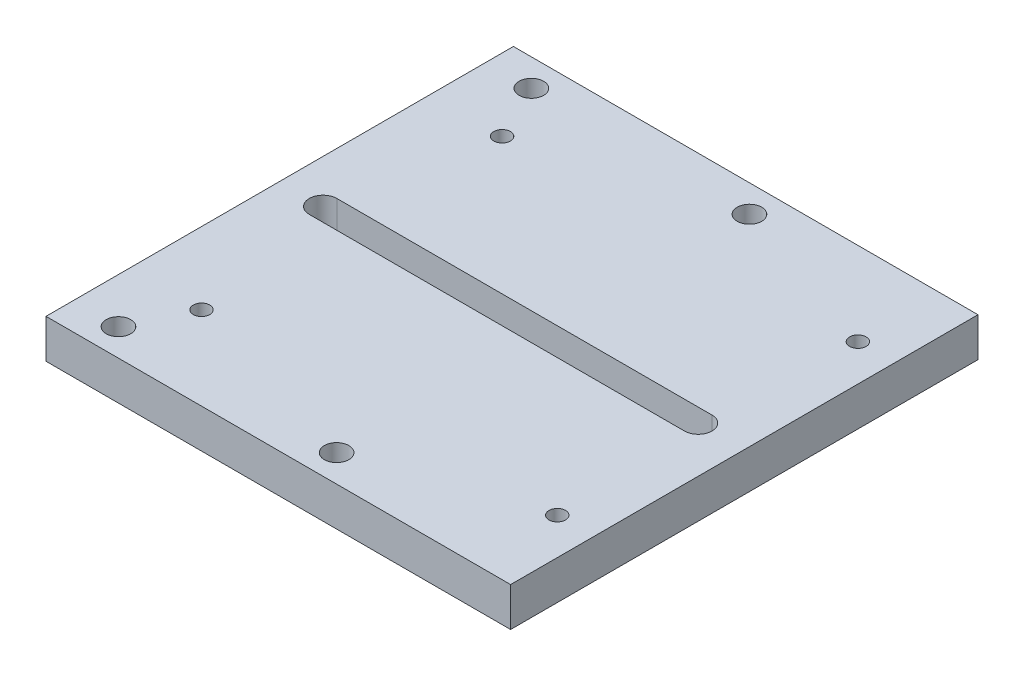
ISO-10303-21;
HEADER;
FILE_DESCRIPTION(('STEP AP214'),'2;1');
FILE_NAME('part.step','',(''),(''),'','','');
FILE_SCHEMA(('AUTOMOTIVE_DESIGN { 1 0 10303 214 1 1 1 1 }'));
ENDSEC;
DATA;
#1=APPLICATION_CONTEXT('core data for automotive mechanical design processes');
#2=APPLICATION_PROTOCOL_DEFINITION('international standard','automotive_design',2000,#1);
#3=PRODUCT_CONTEXT('',#1,'mechanical');
#4=PRODUCT('Part','Part','',(#3));
#5=PRODUCT_RELATED_PRODUCT_CATEGORY('part','',(#4));
#6=PRODUCT_DEFINITION_FORMATION('','',#4);
#7=PRODUCT_DEFINITION_CONTEXT('part definition',#1,'design');
#8=PRODUCT_DEFINITION('design','',#6,#7);
#9=PRODUCT_DEFINITION_SHAPE('','',#8);
#10=(LENGTH_UNIT() NAMED_UNIT(*) SI_UNIT(.MILLI.,.METRE.));
#11=(NAMED_UNIT(*) PLANE_ANGLE_UNIT() SI_UNIT($,.RADIAN.));
#12=(NAMED_UNIT(*) SI_UNIT($,.STERADIAN.) SOLID_ANGLE_UNIT());
#13=UNCERTAINTY_MEASURE_WITH_UNIT(LENGTH_MEASURE(1.E-05),#10,'distance_accuracy_value','');
#14=(GEOMETRIC_REPRESENTATION_CONTEXT(3) GLOBAL_UNCERTAINTY_ASSIGNED_CONTEXT((#13)) GLOBAL_UNIT_ASSIGNED_CONTEXT((#10,
#11,#12)) REPRESENTATION_CONTEXT('',''));
#15=CARTESIAN_POINT('',(0.,0.,0.));
#16=DIRECTION('',(0.,0.,1.));
#17=DIRECTION('',(1.,0.,0.));
#18=AXIS2_PLACEMENT_3D('',#15,#16,#17);
#19=CARTESIAN_POINT('',(0.,6.35,0.));
#20=DIRECTION('',(0.,1.,0.));
#21=DIRECTION('',(0.,0.,1.));
#22=AXIS2_PLACEMENT_3D('',#19,#20,#21);
#23=PLANE('',#22);
#24=CARTESIAN_POINT('',(2.17366498787586,6.35,-33.655));
#25=DIRECTION('',(0.,1.,0.));
#26=DIRECTION('',(0.,0.,1.));
#27=AXIS2_PLACEMENT_3D('',#24,#25,#26);
#28=CIRCLE('',#27,1.999869);
#29=CARTESIAN_POINT('',(2.17366498787586,6.35,-31.655131));
#30=VERTEX_POINT('',#29);
#31=EDGE_CURVE('E146',#30,#30,#28,.T.);
#32=ORIENTED_EDGE('',*,*,#31,.F.);
#33=EDGE_LOOP('',(#32));
#34=FACE_BOUND('',#33,.T.);
#35=CARTESIAN_POINT('',(-33.3863350121241,6.35,-33.655));
#36=DIRECTION('',(0.,1.,0.));
#37=DIRECTION('',(0.,0.,1.));
#38=AXIS2_PLACEMENT_3D('',#35,#36,#37);
#39=CIRCLE('',#38,1.999869);
#40=CARTESIAN_POINT('',(-33.3863350121241,6.35,-31.655131));
#41=VERTEX_POINT('',#40);
#42=EDGE_CURVE('E158',#41,#41,#39,.T.);
#43=ORIENTED_EDGE('',*,*,#42,.F.);
#44=EDGE_LOOP('',(#43));
#45=FACE_BOUND('',#44,.T.);
#46=CARTESIAN_POINT('',(-29.,6.35,-24.5));
#47=DIRECTION('',(0.,1.,0.));
#48=DIRECTION('',(0.,0.,1.));
#49=AXIS2_PLACEMENT_3D('',#46,#47,#48);
#50=CIRCLE('',#49,1.35);
#51=CARTESIAN_POINT('',(-29.,6.35,-23.15));
#52=VERTEX_POINT('',#51);
#53=EDGE_CURVE('E170',#52,#52,#50,.T.);
#54=ORIENTED_EDGE('',*,*,#53,.F.);
#55=EDGE_LOOP('',(#54));
#56=FACE_BOUND('',#55,.T.);
#57=CARTESIAN_POINT('',(-29.,6.35,24.5));
#58=DIRECTION('',(0.,1.,0.));
#59=DIRECTION('',(0.,0.,1.));
#60=AXIS2_PLACEMENT_3D('',#57,#58,#59);
#61=CIRCLE('',#60,1.35000000000001);
#62=CARTESIAN_POINT('',(-29.,6.35,25.85));
#63=VERTEX_POINT('',#62);
#64=EDGE_CURVE('E182',#63,#63,#61,.T.);
#65=ORIENTED_EDGE('',*,*,#64,.F.);
#66=EDGE_LOOP('',(#65));
#67=FACE_BOUND('',#66,.T.);
#68=DIRECTION('',(0.,0.,1.));
#69=VECTOR('',#68,1.);
#70=CARTESIAN_POINT('',(-40.7574186381568,6.35,-38.1));
#71=LINE('',#70,#69);
#72=CARTESIAN_POINT('',(-40.7574186381568,6.35,-38.1));
#73=VERTEX_POINT('',#72);
#74=CARTESIAN_POINT('',(-40.7574186381568,6.35,38.1));
#75=VERTEX_POINT('',#74);
#76=EDGE_CURVE('E188',#73,#75,#71,.T.);
#77=ORIENTED_EDGE('',*,*,#76,.T.);
#78=DIRECTION('',(1.,0.,0.));
#79=VECTOR('',#78,1.);
#80=CARTESIAN_POINT('',(-40.7574186381568,6.35,38.1));
#81=LINE('',#80,#79);
#82=CARTESIAN_POINT('',(34.9873889024097,6.35,38.1));
#83=VERTEX_POINT('',#82);
#84=EDGE_CURVE('E191',#75,#83,#81,.T.);
#85=ORIENTED_EDGE('',*,*,#84,.T.);
#86=DIRECTION('',(0.,0.,-1.));
#87=VECTOR('',#86,1.);
#88=CARTESIAN_POINT('',(34.9873889024097,6.35,-38.1));
#89=LINE('',#88,#87);
#90=CARTESIAN_POINT('',(34.9873889024097,6.35,-38.1));
#91=VERTEX_POINT('',#90);
#92=EDGE_CURVE('E194',#83,#91,#89,.T.);
#93=ORIENTED_EDGE('',*,*,#92,.T.);
#94=DIRECTION('',(-1.,0.,0.));
#95=VECTOR('',#94,1.);
#96=CARTESIAN_POINT('',(-40.7574186381568,6.35,-38.1));
#97=LINE('',#96,#95);
#98=EDGE_CURVE('E196',#91,#73,#97,.T.);
#99=ORIENTED_EDGE('',*,*,#98,.T.);
#100=EDGE_LOOP('',(#77,#85,#93,#99));
#101=FACE_BOUND('',#100,.T.);
#102=CARTESIAN_POINT('',(29.,6.35,24.5));
#103=DIRECTION('',(0.,1.,0.));
#104=DIRECTION('',(0.,0.,1.));
#105=AXIS2_PLACEMENT_3D('',#102,#103,#104);
#106=CIRCLE('',#105,1.35);
#107=CARTESIAN_POINT('',(29.,6.35,25.85));
#108=VERTEX_POINT('',#107);
#109=EDGE_CURVE('E176',#108,#108,#106,.T.);
#110=ORIENTED_EDGE('',*,*,#109,.F.);
#111=EDGE_LOOP('',(#110));
#112=FACE_BOUND('',#111,.T.);
#113=CARTESIAN_POINT('',(29.,6.35,-24.5));
#114=DIRECTION('',(0.,1.,0.));
#115=DIRECTION('',(0.,0.,1.));
#116=AXIS2_PLACEMENT_3D('',#113,#114,#115);
#117=CIRCLE('',#116,1.35);
#118=CARTESIAN_POINT('',(29.,6.35,-23.15));
#119=VERTEX_POINT('',#118);
#120=EDGE_CURVE('E164',#119,#119,#117,.T.);
#121=ORIENTED_EDGE('',*,*,#120,.F.);
#122=EDGE_LOOP('',(#121));
#123=FACE_BOUND('',#122,.T.);
#124=CARTESIAN_POINT('',(-33.3863350121241,6.35,33.655));
#125=DIRECTION('',(0.,1.,0.));
#126=DIRECTION('',(0.,0.,1.));
#127=AXIS2_PLACEMENT_3D('',#124,#125,#126);
#128=CIRCLE('',#127,1.999869);
#129=CARTESIAN_POINT('',(-33.3863350121241,6.35,35.654869));
#130=VERTEX_POINT('',#129);
#131=EDGE_CURVE('E152',#130,#130,#128,.T.);
#132=ORIENTED_EDGE('',*,*,#131,.F.);
#133=EDGE_LOOP('',(#132));
#134=FACE_BOUND('',#133,.T.);
#135=CARTESIAN_POINT('',(2.17366498787587,6.35,33.655));
#136=DIRECTION('',(0.,1.,0.));
#137=DIRECTION('',(0.,0.,1.));
#138=AXIS2_PLACEMENT_3D('',#135,#136,#137);
#139=CIRCLE('',#138,1.999869);
#140=CARTESIAN_POINT('',(2.17366498787587,6.35,35.654869));
#141=VERTEX_POINT('',#140);
#142=EDGE_CURVE('E140',#141,#141,#139,.T.);
#143=ORIENTED_EDGE('',*,*,#142,.F.);
#144=EDGE_LOOP('',(#143));
#145=FACE_BOUND('',#144,.T.);
#146=DIRECTION('',(1.,0.,0.));
#147=VECTOR('',#146,1.);
#148=CARTESIAN_POINT('',(-33.6878478602069,6.35,2.25));
#149=LINE('',#148,#147);
#150=CARTESIAN_POINT('',(-33.6878478602069,6.35,2.25));
#151=VERTEX_POINT('',#150);
#152=CARTESIAN_POINT('',(27.4804743696254,6.35,2.25));
#153=VERTEX_POINT('',#152);
#154=EDGE_CURVE('E112',#151,#153,#149,.T.);
#155=ORIENTED_EDGE('',*,*,#154,.F.);
#156=CARTESIAN_POINT('',(-33.6878478602069,6.35,0.));
#157=DIRECTION('',(0.,1.,0.));
#158=DIRECTION('',(0.,0.,1.));
#159=AXIS2_PLACEMENT_3D('',#156,#157,#158);
#160=CIRCLE('',#159,2.25);
#161=CARTESIAN_POINT('',(-33.6878478602069,6.35,-2.25000000000001));
#162=VERTEX_POINT('',#161);
#163=EDGE_CURVE('E104',#162,#151,#160,.T.);
#164=ORIENTED_EDGE('',*,*,#163,.F.);
#165=DIRECTION('',(-1.,0.,0.));
#166=VECTOR('',#165,1.);
#167=CARTESIAN_POINT('',(-33.6878478602069,6.35,-2.25000000000001));
#168=LINE('',#167,#166);
#169=CARTESIAN_POINT('',(27.4804743696254,6.35,-2.25));
#170=VERTEX_POINT('',#169);
#171=EDGE_CURVE('E126',#170,#162,#168,.T.);
#172=ORIENTED_EDGE('',*,*,#171,.F.);
#173=CARTESIAN_POINT('',(27.4804743696254,6.35,0.));
#174=DIRECTION('',(0.,1.,0.));
#175=DIRECTION('',(0.,0.,1.));
#176=AXIS2_PLACEMENT_3D('',#173,#174,#175);
#177=CIRCLE('',#176,2.25);
#178=EDGE_CURVE('E124',#153,#170,#177,.T.);
#179=ORIENTED_EDGE('',*,*,#178,.F.);
#180=EDGE_LOOP('',(#155,#164,#172,#179));
#181=FACE_BOUND('',#180,.T.);
#182=ADVANCED_FACE('F39',(#34,#45,#56,#67,#101,#112,#123,#134,#145,#181),#23,.T.);
#183=CARTESIAN_POINT('',(0.,0.,0.));
#184=DIRECTION('',(0.,1.,0.));
#185=DIRECTION('',(0.,0.,1.));
#186=AXIS2_PLACEMENT_3D('',#183,#184,#185);
#187=PLANE('',#186);
#188=CARTESIAN_POINT('',(2.17366498787587,0.,33.655));
#189=DIRECTION('',(0.,1.,0.));
#190=DIRECTION('',(0.,0.,1.));
#191=AXIS2_PLACEMENT_3D('',#188,#189,#190);
#192=CIRCLE('',#191,1.999869);
#193=CARTESIAN_POINT('',(2.17366498787587,0.,35.654869));
#194=VERTEX_POINT('',#193);
#195=EDGE_CURVE('E120',#194,#194,#192,.T.);
#196=ORIENTED_EDGE('',*,*,#195,.T.);
#197=EDGE_LOOP('',(#196));
#198=FACE_BOUND('',#197,.T.);
#199=CARTESIAN_POINT('',(2.17366498787586,0.,-33.655));
#200=DIRECTION('',(0.,1.,0.));
#201=DIRECTION('',(0.,0.,1.));
#202=AXIS2_PLACEMENT_3D('',#199,#200,#201);
#203=CIRCLE('',#202,1.999869);
#204=CARTESIAN_POINT('',(2.17366498787586,0.,-31.655131));
#205=VERTEX_POINT('',#204);
#206=EDGE_CURVE('E143',#205,#205,#203,.T.);
#207=ORIENTED_EDGE('',*,*,#206,.T.);
#208=EDGE_LOOP('',(#207));
#209=FACE_BOUND('',#208,.T.);
#210=CARTESIAN_POINT('',(-33.3863350121241,0.,33.655));
#211=DIRECTION('',(0.,1.,0.));
#212=DIRECTION('',(0.,0.,1.));
#213=AXIS2_PLACEMENT_3D('',#210,#211,#212);
#214=CIRCLE('',#213,1.999869);
#215=CARTESIAN_POINT('',(-33.3863350121241,0.,35.654869));
#216=VERTEX_POINT('',#215);
#217=EDGE_CURVE('E149',#216,#216,#214,.T.);
#218=ORIENTED_EDGE('',*,*,#217,.T.);
#219=EDGE_LOOP('',(#218));
#220=FACE_BOUND('',#219,.T.);
#221=CARTESIAN_POINT('',(-33.3863350121241,0.,-33.655));
#222=DIRECTION('',(0.,1.,0.));
#223=DIRECTION('',(0.,0.,1.));
#224=AXIS2_PLACEMENT_3D('',#221,#222,#223);
#225=CIRCLE('',#224,1.999869);
#226=CARTESIAN_POINT('',(-33.3863350121241,0.,-31.655131));
#227=VERTEX_POINT('',#226);
#228=EDGE_CURVE('E155',#227,#227,#225,.T.);
#229=ORIENTED_EDGE('',*,*,#228,.T.);
#230=EDGE_LOOP('',(#229));
#231=FACE_BOUND('',#230,.T.);
#232=CARTESIAN_POINT('',(29.,0.,-24.5));
#233=DIRECTION('',(0.,1.,0.));
#234=DIRECTION('',(0.,0.,1.));
#235=AXIS2_PLACEMENT_3D('',#232,#233,#234);
#236=CIRCLE('',#235,1.35);
#237=CARTESIAN_POINT('',(29.,0.,-23.15));
#238=VERTEX_POINT('',#237);
#239=EDGE_CURVE('E161',#238,#238,#236,.T.);
#240=ORIENTED_EDGE('',*,*,#239,.T.);
#241=EDGE_LOOP('',(#240));
#242=FACE_BOUND('',#241,.T.);
#243=CARTESIAN_POINT('',(-29.,0.,-24.5));
#244=DIRECTION('',(0.,1.,0.));
#245=DIRECTION('',(0.,0.,1.));
#246=AXIS2_PLACEMENT_3D('',#243,#244,#245);
#247=CIRCLE('',#246,1.35);
#248=CARTESIAN_POINT('',(-29.,0.,-23.15));
#249=VERTEX_POINT('',#248);
#250=EDGE_CURVE('E167',#249,#249,#247,.T.);
#251=ORIENTED_EDGE('',*,*,#250,.T.);
#252=EDGE_LOOP('',(#251));
#253=FACE_BOUND('',#252,.T.);
#254=CARTESIAN_POINT('',(29.,0.,24.5));
#255=DIRECTION('',(0.,1.,0.));
#256=DIRECTION('',(0.,0.,1.));
#257=AXIS2_PLACEMENT_3D('',#254,#255,#256);
#258=CIRCLE('',#257,1.35);
#259=CARTESIAN_POINT('',(29.,0.,25.85));
#260=VERTEX_POINT('',#259);
#261=EDGE_CURVE('E173',#260,#260,#258,.T.);
#262=ORIENTED_EDGE('',*,*,#261,.T.);
#263=EDGE_LOOP('',(#262));
#264=FACE_BOUND('',#263,.T.);
#265=CARTESIAN_POINT('',(-29.,0.,24.5));
#266=DIRECTION('',(0.,1.,0.));
#267=DIRECTION('',(0.,0.,1.));
#268=AXIS2_PLACEMENT_3D('',#265,#266,#267);
#269=CIRCLE('',#268,1.35000000000001);
#270=CARTESIAN_POINT('',(-29.,0.,25.85));
#271=VERTEX_POINT('',#270);
#272=EDGE_CURVE('E179',#271,#271,#269,.T.);
#273=ORIENTED_EDGE('',*,*,#272,.T.);
#274=EDGE_LOOP('',(#273));
#275=FACE_BOUND('',#274,.T.);
#276=DIRECTION('',(0.,0.,1.));
#277=VECTOR('',#276,1.);
#278=CARTESIAN_POINT('',(-40.7574186381568,0.,-38.1));
#279=LINE('',#278,#277);
#280=CARTESIAN_POINT('',(-40.7574186381568,0.,-38.1));
#281=VERTEX_POINT('',#280);
#282=CARTESIAN_POINT('',(-40.7574186381568,0.,38.1));
#283=VERTEX_POINT('',#282);
#284=EDGE_CURVE('E185',#281,#283,#279,.T.);
#285=ORIENTED_EDGE('',*,*,#284,.F.);
#286=DIRECTION('',(-1.,0.,0.));
#287=VECTOR('',#286,1.);
#288=CARTESIAN_POINT('',(-40.7574186381568,0.,-38.1));
#289=LINE('',#288,#287);
#290=CARTESIAN_POINT('',(34.9873889024097,0.,-38.1));
#291=VERTEX_POINT('',#290);
#292=EDGE_CURVE('E192',#291,#281,#289,.T.);
#293=ORIENTED_EDGE('',*,*,#292,.F.);
#294=DIRECTION('',(0.,0.,-1.));
#295=VECTOR('',#294,1.);
#296=CARTESIAN_POINT('',(34.9873889024097,0.,-38.1));
#297=LINE('',#296,#295);
#298=CARTESIAN_POINT('',(34.9873889024097,0.,38.1));
#299=VERTEX_POINT('',#298);
#300=EDGE_CURVE('E203',#299,#291,#297,.T.);
#301=ORIENTED_EDGE('',*,*,#300,.F.);
#302=DIRECTION('',(1.,0.,0.));
#303=VECTOR('',#302,1.);
#304=CARTESIAN_POINT('',(-40.7574186381568,0.,38.1));
#305=LINE('',#304,#303);
#306=EDGE_CURVE('E201',#283,#299,#305,.T.);
#307=ORIENTED_EDGE('',*,*,#306,.F.);
#308=EDGE_LOOP('',(#285,#293,#301,#307));
#309=FACE_BOUND('',#308,.T.);
#310=CARTESIAN_POINT('',(-33.6878478602069,0.,0.));
#311=DIRECTION('',(0.,1.,0.));
#312=DIRECTION('',(0.,0.,1.));
#313=AXIS2_PLACEMENT_3D('',#310,#311,#312);
#314=CIRCLE('',#313,2.25);
#315=CARTESIAN_POINT('',(-33.6878478602069,0.,-2.25000000000001));
#316=VERTEX_POINT('',#315);
#317=CARTESIAN_POINT('',(-33.6878478602069,0.,2.25));
#318=VERTEX_POINT('',#317);
#319=EDGE_CURVE('E62',#316,#318,#314,.T.);
#320=ORIENTED_EDGE('',*,*,#319,.T.);
#321=DIRECTION('',(1.,0.,0.));
#322=VECTOR('',#321,1.);
#323=CARTESIAN_POINT('',(-33.6878478602069,0.,2.25));
#324=LINE('',#323,#322);
#325=CARTESIAN_POINT('',(27.4804743696254,0.,2.25));
#326=VERTEX_POINT('',#325);
#327=EDGE_CURVE('E119',#318,#326,#324,.T.);
#328=ORIENTED_EDGE('',*,*,#327,.T.);
#329=CARTESIAN_POINT('',(27.4804743696254,0.,0.));
#330=DIRECTION('',(0.,1.,0.));
#331=DIRECTION('',(0.,0.,1.));
#332=AXIS2_PLACEMENT_3D('',#329,#330,#331);
#333=CIRCLE('',#332,2.25);
#334=CARTESIAN_POINT('',(27.4804743696254,0.,-2.25));
#335=VERTEX_POINT('',#334);
#336=EDGE_CURVE('E132',#326,#335,#333,.T.);
#337=ORIENTED_EDGE('',*,*,#336,.T.);
#338=DIRECTION('',(-1.,0.,0.));
#339=VECTOR('',#338,1.);
#340=CARTESIAN_POINT('',(-33.6878478602069,0.,-2.25000000000001));
#341=LINE('',#340,#339);
#342=EDGE_CURVE('E113',#335,#316,#341,.T.);
#343=ORIENTED_EDGE('',*,*,#342,.T.);
#344=EDGE_LOOP('',(#320,#328,#337,#343));
#345=FACE_BOUND('',#344,.T.);
#346=ADVANCED_FACE('F221',(#198,#209,#220,#231,#242,#253,#264,#275,#309,#345),#187,.F.);
#347=CARTESIAN_POINT('',(-40.7574186381568,6.35,-38.1));
#348=DIRECTION('',(1.,0.,0.));
#349=DIRECTION('',(0.,0.,-1.));
#350=AXIS2_PLACEMENT_3D('',#347,#348,#349);
#351=PLANE('',#350);
#352=ORIENTED_EDGE('',*,*,#284,.T.);
#353=DIRECTION('',(0.,-1.,0.));
#354=VECTOR('',#353,1.);
#355=CARTESIAN_POINT('',(-40.7574186381568,6.35,38.1));
#356=LINE('',#355,#354);
#357=EDGE_CURVE('E11',#75,#283,#356,.T.);
#358=ORIENTED_EDGE('',*,*,#357,.F.);
#359=ORIENTED_EDGE('',*,*,#76,.F.);
#360=DIRECTION('',(0.,-1.,0.));
#361=VECTOR('',#360,1.);
#362=CARTESIAN_POINT('',(-40.7574186381568,6.35,-38.1));
#363=LINE('',#362,#361);
#364=EDGE_CURVE('E198',#73,#281,#363,.T.);
#365=ORIENTED_EDGE('',*,*,#364,.T.);
#366=EDGE_LOOP('',(#352,#358,#359,#365));
#367=FACE_BOUND('',#366,.T.);
#368=ADVANCED_FACE('F41',(#367),#351,.F.);
#369=CARTESIAN_POINT('',(-40.7574186381568,6.35,38.1));
#370=DIRECTION('',(0.,0.,-1.));
#371=DIRECTION('',(-1.,0.,0.));
#372=AXIS2_PLACEMENT_3D('',#369,#370,#371);
#373=PLANE('',#372);
#374=ORIENTED_EDGE('',*,*,#306,.T.);
#375=DIRECTION('',(0.,-1.,0.));
#376=VECTOR('',#375,1.);
#377=CARTESIAN_POINT('',(34.9873889024097,6.35,38.1));
#378=LINE('',#377,#376);
#379=EDGE_CURVE('E47',#83,#299,#378,.T.);
#380=ORIENTED_EDGE('',*,*,#379,.F.);
#381=ORIENTED_EDGE('',*,*,#84,.F.);
#382=ORIENTED_EDGE('',*,*,#357,.T.);
#383=EDGE_LOOP('',(#374,#380,#381,#382));
#384=FACE_BOUND('',#383,.T.);
#385=ADVANCED_FACE('F232',(#384),#373,.F.);
#386=CARTESIAN_POINT('',(34.9873889024097,6.35,-38.1));
#387=DIRECTION('',(-1.,0.,0.));
#388=DIRECTION('',(0.,0.,1.));
#389=AXIS2_PLACEMENT_3D('',#386,#387,#388);
#390=PLANE('',#389);
#391=ORIENTED_EDGE('',*,*,#300,.T.);
#392=DIRECTION('',(0.,-1.,0.));
#393=VECTOR('',#392,1.);
#394=CARTESIAN_POINT('',(34.9873889024097,6.35,-38.1));
#395=LINE('',#394,#393);
#396=EDGE_CURVE('E208',#91,#291,#395,.T.);
#397=ORIENTED_EDGE('',*,*,#396,.F.);
#398=ORIENTED_EDGE('',*,*,#92,.F.);
#399=ORIENTED_EDGE('',*,*,#379,.T.);
#400=EDGE_LOOP('',(#391,#397,#398,#399));
#401=FACE_BOUND('',#400,.T.);
#402=ADVANCED_FACE('F215',(#401),#390,.F.);
#403=CARTESIAN_POINT('',(-40.7574186381568,6.35,-38.1));
#404=DIRECTION('',(0.,0.,1.));
#405=DIRECTION('',(1.,0.,0.));
#406=AXIS2_PLACEMENT_3D('',#403,#404,#405);
#407=PLANE('',#406);
#408=ORIENTED_EDGE('',*,*,#292,.T.);
#409=ORIENTED_EDGE('',*,*,#364,.F.);
#410=ORIENTED_EDGE('',*,*,#98,.F.);
#411=ORIENTED_EDGE('',*,*,#396,.T.);
#412=EDGE_LOOP('',(#408,#409,#410,#411));
#413=FACE_BOUND('',#412,.T.);
#414=ADVANCED_FACE('F225',(#413),#407,.F.);
#415=CARTESIAN_POINT('',(-29.,6.35,24.5));
#416=DIRECTION('',(0.,-1.,0.));
#417=DIRECTION('',(0.,0.,-1.));
#418=AXIS2_PLACEMENT_3D('',#415,#416,#417);
#419=CYLINDRICAL_SURFACE('',#418,1.35000000000001);
#420=ORIENTED_EDGE('',*,*,#64,.T.);
#421=EDGE_LOOP('',(#420));
#422=FACE_BOUND('',#421,.T.);
#423=ORIENTED_EDGE('',*,*,#272,.F.);
#424=EDGE_LOOP('',(#423));
#425=FACE_BOUND('',#424,.T.);
#426=ADVANCED_FACE('F250',(#422,#425),#419,.F.);
#427=CARTESIAN_POINT('',(29.,6.35,24.5));
#428=DIRECTION('',(0.,-1.,0.));
#429=DIRECTION('',(0.,0.,-1.));
#430=AXIS2_PLACEMENT_3D('',#427,#428,#429);
#431=CYLINDRICAL_SURFACE('',#430,1.35);
#432=ORIENTED_EDGE('',*,*,#109,.T.);
#433=EDGE_LOOP('',(#432));
#434=FACE_BOUND('',#433,.T.);
#435=ORIENTED_EDGE('',*,*,#261,.F.);
#436=EDGE_LOOP('',(#435));
#437=FACE_BOUND('',#436,.T.);
#438=ADVANCED_FACE('F257',(#434,#437),#431,.F.);
#439=CARTESIAN_POINT('',(-29.,6.35,-24.5));
#440=DIRECTION('',(0.,-1.,0.));
#441=DIRECTION('',(0.,0.,-1.));
#442=AXIS2_PLACEMENT_3D('',#439,#440,#441);
#443=CYLINDRICAL_SURFACE('',#442,1.35);
#444=ORIENTED_EDGE('',*,*,#53,.T.);
#445=EDGE_LOOP('',(#444));
#446=FACE_BOUND('',#445,.T.);
#447=ORIENTED_EDGE('',*,*,#250,.F.);
#448=EDGE_LOOP('',(#447));
#449=FACE_BOUND('',#448,.T.);
#450=ADVANCED_FACE('F262',(#446,#449),#443,.F.);
#451=CARTESIAN_POINT('',(29.,6.35,-24.5));
#452=DIRECTION('',(0.,-1.,0.));
#453=DIRECTION('',(0.,0.,-1.));
#454=AXIS2_PLACEMENT_3D('',#451,#452,#453);
#455=CYLINDRICAL_SURFACE('',#454,1.35);
#456=ORIENTED_EDGE('',*,*,#120,.T.);
#457=EDGE_LOOP('',(#456));
#458=FACE_BOUND('',#457,.T.);
#459=ORIENTED_EDGE('',*,*,#239,.F.);
#460=EDGE_LOOP('',(#459));
#461=FACE_BOUND('',#460,.T.);
#462=ADVANCED_FACE('F272',(#458,#461),#455,.F.);
#463=CARTESIAN_POINT('',(-33.3863350121241,6.35,-33.655));
#464=DIRECTION('',(0.,-1.,0.));
#465=DIRECTION('',(0.,0.,-1.));
#466=AXIS2_PLACEMENT_3D('',#463,#464,#465);
#467=CYLINDRICAL_SURFACE('',#466,1.999869);
#468=ORIENTED_EDGE('',*,*,#42,.T.);
#469=EDGE_LOOP('',(#468));
#470=FACE_BOUND('',#469,.T.);
#471=ORIENTED_EDGE('',*,*,#228,.F.);
#472=EDGE_LOOP('',(#471));
#473=FACE_BOUND('',#472,.T.);
#474=ADVANCED_FACE('F279',(#470,#473),#467,.F.);
#475=CARTESIAN_POINT('',(-33.3863350121241,6.35,33.655));
#476=DIRECTION('',(0.,-1.,0.));
#477=DIRECTION('',(0.,0.,-1.));
#478=AXIS2_PLACEMENT_3D('',#475,#476,#477);
#479=CYLINDRICAL_SURFACE('',#478,1.999869);
#480=ORIENTED_EDGE('',*,*,#131,.T.);
#481=EDGE_LOOP('',(#480));
#482=FACE_BOUND('',#481,.T.);
#483=ORIENTED_EDGE('',*,*,#217,.F.);
#484=EDGE_LOOP('',(#483));
#485=FACE_BOUND('',#484,.T.);
#486=ADVANCED_FACE('F283',(#482,#485),#479,.F.);
#487=CARTESIAN_POINT('',(2.17366498787586,6.35,-33.655));
#488=DIRECTION('',(0.,-1.,0.));
#489=DIRECTION('',(0.,0.,-1.));
#490=AXIS2_PLACEMENT_3D('',#487,#488,#489);
#491=CYLINDRICAL_SURFACE('',#490,1.999869);
#492=ORIENTED_EDGE('',*,*,#31,.T.);
#493=EDGE_LOOP('',(#492));
#494=FACE_BOUND('',#493,.T.);
#495=ORIENTED_EDGE('',*,*,#206,.F.);
#496=EDGE_LOOP('',(#495));
#497=FACE_BOUND('',#496,.T.);
#498=ADVANCED_FACE('F287',(#494,#497),#491,.F.);
#499=CARTESIAN_POINT('',(2.17366498787587,6.35,33.655));
#500=DIRECTION('',(0.,-1.,0.));
#501=DIRECTION('',(0.,0.,-1.));
#502=AXIS2_PLACEMENT_3D('',#499,#500,#501);
#503=CYLINDRICAL_SURFACE('',#502,1.999869);
#504=ORIENTED_EDGE('',*,*,#142,.T.);
#505=EDGE_LOOP('',(#504));
#506=FACE_BOUND('',#505,.T.);
#507=ORIENTED_EDGE('',*,*,#195,.F.);
#508=EDGE_LOOP('',(#507));
#509=FACE_BOUND('',#508,.T.);
#510=ADVANCED_FACE('F291',(#506,#509),#503,.F.);
#511=CARTESIAN_POINT('',(-33.6878478602069,6.35,0.));
#512=DIRECTION('',(0.,-1.,0.));
#513=DIRECTION('',(0.,0.,-1.));
#514=AXIS2_PLACEMENT_3D('',#511,#512,#513);
#515=CYLINDRICAL_SURFACE('',#514,2.25);
#516=ORIENTED_EDGE('',*,*,#319,.F.);
#517=DIRECTION('',(0.,-1.,0.));
#518=VECTOR('',#517,1.);
#519=CARTESIAN_POINT('',(-33.6878478602069,6.35,-2.25000000000001));
#520=LINE('',#519,#518);
#521=EDGE_CURVE('E108',#162,#316,#520,.T.);
#522=ORIENTED_EDGE('',*,*,#521,.F.);
#523=ORIENTED_EDGE('',*,*,#163,.T.);
#524=DIRECTION('',(0.,-1.,0.));
#525=VECTOR('',#524,1.);
#526=CARTESIAN_POINT('',(-33.6878478602069,6.35,2.25));
#527=LINE('',#526,#525);
#528=EDGE_CURVE('E107',#151,#318,#527,.T.);
#529=ORIENTED_EDGE('',*,*,#528,.T.);
#530=EDGE_LOOP('',(#516,#522,#523,#529));
#531=FACE_BOUND('',#530,.T.);
#532=ADVANCED_FACE('F106',(#531),#515,.F.);
#533=CARTESIAN_POINT('',(-33.6878478602069,6.35,2.25));
#534=DIRECTION('',(0.,0.,-1.));
#535=DIRECTION('',(-1.,0.,0.));
#536=AXIS2_PLACEMENT_3D('',#533,#534,#535);
#537=PLANE('',#536);
#538=ORIENTED_EDGE('',*,*,#327,.F.);
#539=ORIENTED_EDGE('',*,*,#528,.F.);
#540=ORIENTED_EDGE('',*,*,#154,.T.);
#541=DIRECTION('',(0.,-1.,0.));
#542=VECTOR('',#541,1.);
#543=CARTESIAN_POINT('',(27.4804743696254,6.35,2.25));
#544=LINE('',#543,#542);
#545=EDGE_CURVE('E121',#153,#326,#544,.T.);
#546=ORIENTED_EDGE('',*,*,#545,.T.);
#547=EDGE_LOOP('',(#538,#539,#540,#546));
#548=FACE_BOUND('',#547,.T.);
#549=ADVANCED_FACE('F116',(#548),#537,.T.);
#550=CARTESIAN_POINT('',(27.4804743696254,6.35,0.));
#551=DIRECTION('',(0.,-1.,0.));
#552=DIRECTION('',(0.,0.,-1.));
#553=AXIS2_PLACEMENT_3D('',#550,#551,#552);
#554=CYLINDRICAL_SURFACE('',#553,2.25);
#555=ORIENTED_EDGE('',*,*,#336,.F.);
#556=ORIENTED_EDGE('',*,*,#545,.F.);
#557=ORIENTED_EDGE('',*,*,#178,.T.);
#558=DIRECTION('',(0.,-1.,0.));
#559=VECTOR('',#558,1.);
#560=CARTESIAN_POINT('',(27.4804743696254,6.35,-2.25));
#561=LINE('',#560,#559);
#562=EDGE_CURVE('E54',#170,#335,#561,.T.);
#563=ORIENTED_EDGE('',*,*,#562,.T.);
#564=EDGE_LOOP('',(#555,#556,#557,#563));
#565=FACE_BOUND('',#564,.T.);
#566=ADVANCED_FACE('F300',(#565),#554,.F.);
#567=CARTESIAN_POINT('',(-33.6878478602069,6.35,-2.25000000000001));
#568=DIRECTION('',(0.,0.,1.));
#569=DIRECTION('',(1.,0.,0.));
#570=AXIS2_PLACEMENT_3D('',#567,#568,#569);
#571=PLANE('',#570);
#572=ORIENTED_EDGE('',*,*,#342,.F.);
#573=ORIENTED_EDGE('',*,*,#562,.F.);
#574=ORIENTED_EDGE('',*,*,#171,.T.);
#575=ORIENTED_EDGE('',*,*,#521,.T.);
#576=EDGE_LOOP('',(#572,#573,#574,#575));
#577=FACE_BOUND('',#576,.T.);
#578=ADVANCED_FACE('F303',(#577),#571,.T.);
#579=CLOSED_SHELL('',(#182,#346,#368,#385,#402,#414,#426,#438,#450,#462,#474,#486,#498,#510,
#532,#549,#566,#578));
#580=MANIFOLD_SOLID_BREP('B2',#579);
#581=ADVANCED_BREP_SHAPE_REPRESENTATION('',(#18,#580),#14);
#582=SHAPE_DEFINITION_REPRESENTATION(#9,#581);
ENDSEC;
END-ISO-10303-21;
